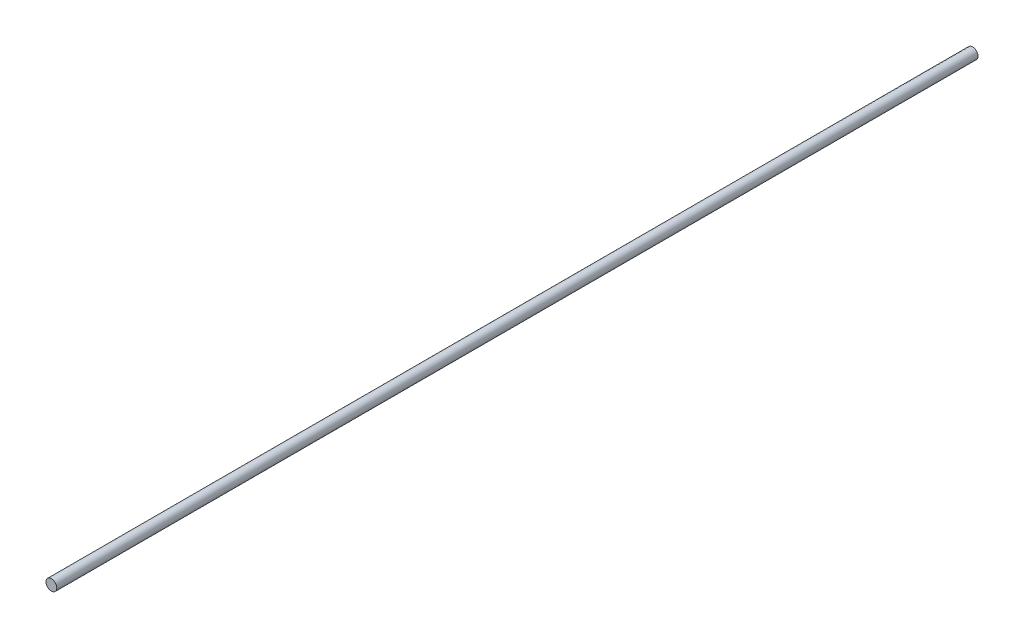
ISO-10303-21;
HEADER;
FILE_DESCRIPTION(('STEP AP214'),'2;1');
FILE_NAME('part.step','',(''),(''),'','','');
FILE_SCHEMA(('AUTOMOTIVE_DESIGN { 1 0 10303 214 1 1 1 1 }'));
ENDSEC;
DATA;
#1=APPLICATION_CONTEXT('core data for automotive mechanical design processes');
#2=APPLICATION_PROTOCOL_DEFINITION('international standard','automotive_design',2000,#1);
#3=PRODUCT_CONTEXT('',#1,'mechanical');
#4=PRODUCT('Part','Part','',(#3));
#5=PRODUCT_RELATED_PRODUCT_CATEGORY('part','',(#4));
#6=PRODUCT_DEFINITION_FORMATION('','',#4);
#7=PRODUCT_DEFINITION_CONTEXT('part definition',#1,'design');
#8=PRODUCT_DEFINITION('design','',#6,#7);
#9=PRODUCT_DEFINITION_SHAPE('','',#8);
#10=(LENGTH_UNIT() NAMED_UNIT(*) SI_UNIT(.MILLI.,.METRE.));
#11=(NAMED_UNIT(*) PLANE_ANGLE_UNIT() SI_UNIT($,.RADIAN.));
#12=(NAMED_UNIT(*) SI_UNIT($,.STERADIAN.) SOLID_ANGLE_UNIT());
#13=UNCERTAINTY_MEASURE_WITH_UNIT(LENGTH_MEASURE(1.E-05),#10,'distance_accuracy_value','');
#14=(GEOMETRIC_REPRESENTATION_CONTEXT(3) GLOBAL_UNCERTAINTY_ASSIGNED_CONTEXT((#13)) GLOBAL_UNIT_ASSIGNED_CONTEXT((#10,
#11,#12)) REPRESENTATION_CONTEXT('',''));
#15=CARTESIAN_POINT('',(0.,0.,0.));
#16=DIRECTION('',(0.,0.,1.));
#17=DIRECTION('',(1.,0.,0.));
#18=AXIS2_PLACEMENT_3D('',#15,#16,#17);
#19=CARTESIAN_POINT('',(0.,0.,854.));
#20=DIRECTION('',(0.,0.,1.));
#21=DIRECTION('',(1.,0.,0.));
#22=AXIS2_PLACEMENT_3D('',#19,#20,#21);
#23=PLANE('',#22);
#24=CARTESIAN_POINT('',(0.,0.,854.));
#25=DIRECTION('',(0.,0.,1.));
#26=DIRECTION('',(1.,0.,0.));
#27=AXIS2_PLACEMENT_3D('',#24,#25,#26);
#28=CIRCLE('',#27,5.);
#29=CARTESIAN_POINT('',(5.,0.,854.));
#30=VERTEX_POINT('',#29);
#31=EDGE_CURVE('P0_E18',#30,#30,#28,.F.);
#32=ORIENTED_EDGE('',*,*,#31,.F.);
#33=EDGE_LOOP('',(#32));
#34=FACE_BOUND('',#33,.T.);
#35=ADVANCED_FACE('P0_F15',(#34),#23,.T.);
#36=CARTESIAN_POINT('',(0.,0.,0.));
#37=DIRECTION('',(0.,0.,1.));
#38=DIRECTION('',(1.,0.,0.));
#39=AXIS2_PLACEMENT_3D('',#36,#37,#38);
#40=PLANE('',#39);
#41=CARTESIAN_POINT('',(0.,0.,0.));
#42=DIRECTION('',(0.,0.,1.));
#43=DIRECTION('',(1.,0.,0.));
#44=AXIS2_PLACEMENT_3D('',#41,#42,#43);
#45=CIRCLE('',#44,5.);
#46=CARTESIAN_POINT('',(5.,0.,0.));
#47=VERTEX_POINT('',#46);
#48=EDGE_CURVE('P0_E10',#47,#47,#45,.T.);
#49=ORIENTED_EDGE('',*,*,#48,.F.);
#50=EDGE_LOOP('',(#49));
#51=FACE_BOUND('',#50,.T.);
#52=ADVANCED_FACE('P0_F30',(#51),#40,.F.);
#53=CARTESIAN_POINT('',(0.,0.,0.));
#54=DIRECTION('',(0.,0.,1.));
#55=DIRECTION('',(1.,0.,0.));
#56=AXIS2_PLACEMENT_3D('',#53,#54,#55);
#57=CYLINDRICAL_SURFACE('',#56,5.);
#58=ORIENTED_EDGE('',*,*,#31,.T.);
#59=EDGE_LOOP('',(#58));
#60=FACE_BOUND('',#59,.T.);
#61=ORIENTED_EDGE('',*,*,#48,.T.);
#62=EDGE_LOOP('',(#61));
#63=FACE_BOUND('',#62,.T.);
#64=ADVANCED_FACE('P0_F27',(#60,#63),#57,.T.);
#65=CLOSED_SHELL('',(#35,#52,#64));
#66=MANIFOLD_SOLID_BREP('P0_B1',#65);
#67=CARTESIAN_POINT('',(0.,0.,854.));
#68=DIRECTION('',(0.,0.,1.));
#69=DIRECTION('',(1.,0.,0.));
#70=AXIS2_PLACEMENT_3D('',#67,#68,#69);
#71=CYLINDRICAL_SURFACE('',#70,4.5);
#72=CARTESIAN_POINT('',(0.,0.,354.));
#73=DIRECTION('',(0.,0.,1.));
#74=DIRECTION('',(1.,0.,0.));
#75=AXIS2_PLACEMENT_3D('',#72,#73,#74);
#76=CIRCLE('',#75,4.5);
#77=CARTESIAN_POINT('',(4.5,0.,354.));
#78=VERTEX_POINT('',#77);
#79=EDGE_CURVE('P1_E21',#78,#78,#76,.T.);
#80=ORIENTED_EDGE('',*,*,#79,.T.);
#81=EDGE_LOOP('',(#80));
#82=FACE_BOUND('',#81,.T.);
#83=CARTESIAN_POINT('',(0.,0.,854.));
#84=DIRECTION('',(0.,0.,1.));
#85=DIRECTION('',(1.,0.,0.));
#86=AXIS2_PLACEMENT_3D('',#83,#84,#85);
#87=CIRCLE('',#86,4.5);
#88=CARTESIAN_POINT('',(4.5,0.,854.));
#89=VERTEX_POINT('',#88);
#90=EDGE_CURVE('P1_E11',#89,#89,#87,.F.);
#91=ORIENTED_EDGE('',*,*,#90,.T.);
#92=EDGE_LOOP('',(#91));
#93=FACE_BOUND('',#92,.T.);
#94=ADVANCED_FACE('P1_F17',(#82,#93),#71,.T.);
#95=CARTESIAN_POINT('',(0.,0.,354.));
#96=DIRECTION('',(0.,0.,1.));
#97=DIRECTION('',(1.,0.,0.));
#98=AXIS2_PLACEMENT_3D('',#95,#96,#97);
#99=PLANE('',#98);
#100=ORIENTED_EDGE('',*,*,#79,.F.);
#101=EDGE_LOOP('',(#100));
#102=FACE_BOUND('',#101,.T.);
#103=CARTESIAN_POINT('',(-5.,0.,354.));
#104=CARTESIAN_POINT('',(-5.,-0.953450226936011,354.));
#105=CARTESIAN_POINT('',(-4.64894150531215,-1.84047354780936,354.));
#106=CARTESIAN_POINT('',(-4.46259759344923,-2.3113107388369,354.));
#107=CARTESIAN_POINT('',(-4.18497755609326,-2.73604876692571,354.));
#108=CARTESIAN_POINT('',(-3.90198967499102,-3.16899919707884,354.));
#109=CARTESIAN_POINT('',(-3.53553390593274,-3.53553390593274,354.));
#110=CARTESIAN_POINT('',(-3.16983549464971,-3.90131109386573,354.));
#111=CARTESIAN_POINT('',(-2.73604876692571,-4.18497755609326,354.));
#112=CARTESIAN_POINT('',(-2.31224779636253,-4.46211402506504,354.));
#113=CARTESIAN_POINT('',(-1.84047354780936,-4.64894150531215,354.));
#114=CARTESIAN_POINT('',(-0.954240935002209,-4.99989878301723,354.));
#115=CARTESIAN_POINT('',(0.,-5.,354.));
#116=CARTESIAN_POINT('',(0.953194761268544,-5.00010110601441,354.));
#117=CARTESIAN_POINT('',(1.84047354780936,-4.64894150531215,354.));
#118=CARTESIAN_POINT('',(2.31131073883759,-4.46259759344896,354.));
#119=CARTESIAN_POINT('',(2.73604876692571,-4.18497755609326,354.));
#120=CARTESIAN_POINT('',(3.16899919708056,-3.90198967498971,354.));
#121=CARTESIAN_POINT('',(3.53553390593274,-3.53553390593274,354.));
#122=CARTESIAN_POINT('',(3.9013110938664,-3.16983549464862,354.));
#123=CARTESIAN_POINT('',(4.18497755609326,-2.73604876692571,354.));
#124=CARTESIAN_POINT('',(4.46211402506561,-2.31224779636172,354.));
#125=CARTESIAN_POINT('',(4.64894150531215,-1.84047354780936,354.));
#126=CARTESIAN_POINT('',(4.82786195715581,-1.38866602138019,354.));
#127=CARTESIAN_POINT('',(4.91652684208287,-0.909815262060723,354.));
#128=CARTESIAN_POINT('',(5.,-0.45900336415673,354.));
#129=CARTESIAN_POINT('',(5.,0.,354.));
#130=B_SPLINE_CURVE_WITH_KNOTS('',2,(#103,#104,#105,#106,#107,#108,#109,#110,#111,#112,#113,
#114,#115,#116,#117,#118,#119,#120,#121,#122,#123,#124,#125,#126,#127,#128,#129),.UNSPECIFIED.,
.F.,.F.,(3,2,2,2,2,2,2,2,2,2,2,2,2,3),(0.,0.125,0.1875,0.25,0.3125,0.375,0.5,0.625,0.6875,0.75,
0.8125,0.875,0.9375,1.),.UNSPECIFIED.);
#131=CARTESIAN_POINT('',(-5.,0.,354.));
#132=VERTEX_POINT('',#131);
#133=CARTESIAN_POINT('',(5.,0.,354.));
#134=VERTEX_POINT('',#133);
#135=EDGE_CURVE('P1_E31',#132,#134,#130,.T.);
#136=ORIENTED_EDGE('',*,*,#135,.T.);
#137=CARTESIAN_POINT('',(5.,0.,354.));
#138=CARTESIAN_POINT('',(5.,0.953450226936011,354.));
#139=CARTESIAN_POINT('',(4.64894150531215,1.84047354780936,354.));
#140=CARTESIAN_POINT('',(4.46259759344923,2.3113107388369,354.));
#141=CARTESIAN_POINT('',(4.18497755609326,2.73604876692571,354.));
#142=CARTESIAN_POINT('',(3.90198967499102,3.16899919707884,354.));
#143=CARTESIAN_POINT('',(3.53553390593274,3.53553390593274,354.));
#144=CARTESIAN_POINT('',(3.16983549464971,3.90131109386573,354.));
#145=CARTESIAN_POINT('',(2.73604876692571,4.18497755609326,354.));
#146=CARTESIAN_POINT('',(2.31224779636253,4.46211402506504,354.));
#147=CARTESIAN_POINT('',(1.84047354780936,4.64894150531215,354.));
#148=CARTESIAN_POINT('',(0.954240935002209,4.99989878301723,354.));
#149=CARTESIAN_POINT('',(0.,5.,354.));
#150=CARTESIAN_POINT('',(-0.953194761268544,5.00010110601441,354.));
#151=CARTESIAN_POINT('',(-1.84047354780936,4.64894150531215,354.));
#152=CARTESIAN_POINT('',(-2.31131073883759,4.46259759344896,354.));
#153=CARTESIAN_POINT('',(-2.73604876692571,4.18497755609326,354.));
#154=CARTESIAN_POINT('',(-3.16899919708056,3.90198967498971,354.));
#155=CARTESIAN_POINT('',(-3.53553390593274,3.53553390593274,354.));
#156=CARTESIAN_POINT('',(-3.9013110938664,3.16983549464862,354.));
#157=CARTESIAN_POINT('',(-4.18497755609326,2.73604876692571,354.));
#158=CARTESIAN_POINT('',(-4.46211402506561,2.31224779636172,354.));
#159=CARTESIAN_POINT('',(-4.64894150531215,1.84047354780936,354.));
#160=CARTESIAN_POINT('',(-4.82786195715581,1.38866602138019,354.));
#161=CARTESIAN_POINT('',(-4.91652684208287,0.909815262060723,354.));
#162=CARTESIAN_POINT('',(-5.,0.45900336415673,354.));
#163=CARTESIAN_POINT('',(-5.,0.,354.));
#164=B_SPLINE_CURVE_WITH_KNOTS('',2,(#137,#138,#139,#140,#141,#142,#143,#144,#145,#146,#147,
#148,#149,#150,#151,#152,#153,#154,#155,#156,#157,#158,#159,#160,#161,#162,#163),.UNSPECIFIED.,
.F.,.F.,(3,2,2,2,2,2,2,2,2,2,2,2,2,3),(0.,0.125,0.1875,0.25,0.3125,0.375,0.5,0.625,0.6875,0.75,
0.8125,0.875,0.9375,1.),.UNSPECIFIED.);
#165=EDGE_CURVE('P1_E34',#134,#132,#164,.T.);
#166=ORIENTED_EDGE('',*,*,#165,.T.);
#167=EDGE_LOOP('',(#136,#166));
#168=FACE_BOUND('',#167,.T.);
#169=ADVANCED_FACE('P1_F18',(#102,#168),#99,.T.);
#170=OPEN_SHELL('',(#94,#169));
#171=SHELL_BASED_SURFACE_MODEL('P1_B1',(#170));
#172=ADVANCED_BREP_SHAPE_REPRESENTATION('',(#18,#66),#14);
#173=MANIFOLD_SURFACE_SHAPE_REPRESENTATION('',(#18,#171),#14);
#174=SHAPE_REPRESENTATION('',(#18),#14);
#175=SHAPE_DEFINITION_REPRESENTATION(#9,#174);
#176=SHAPE_REPRESENTATION_RELATIONSHIP('','',#174,#172);
#177=SHAPE_REPRESENTATION_RELATIONSHIP('','',#174,#173);
ENDSEC;
END-ISO-10303-21;
